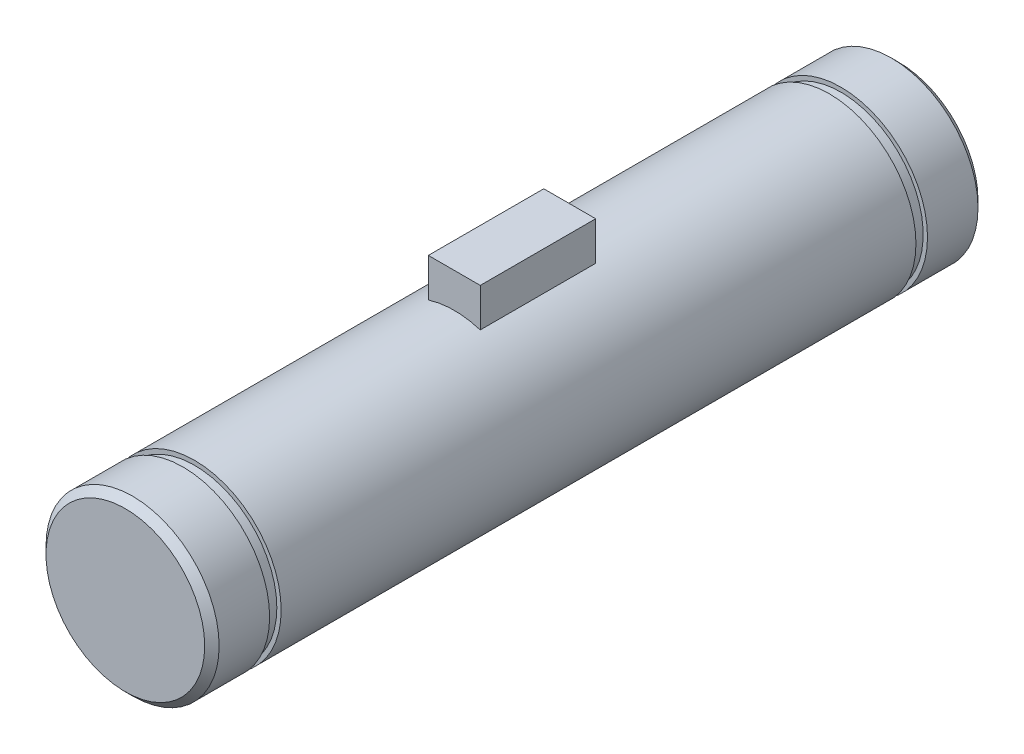
ISO-10303-21;
HEADER;
FILE_DESCRIPTION(('STEP AP214'),'2;1');
FILE_NAME('part.step','',(''),(''),'','','');
FILE_SCHEMA(('AUTOMOTIVE_DESIGN { 1 0 10303 214 1 1 1 1 }'));
ENDSEC;
DATA;
#1=APPLICATION_CONTEXT('core data for automotive mechanical design processes');
#2=APPLICATION_PROTOCOL_DEFINITION('international standard','automotive_design',2000,#1);
#3=PRODUCT_CONTEXT('',#1,'mechanical');
#4=PRODUCT('Part','Part','',(#3));
#5=PRODUCT_RELATED_PRODUCT_CATEGORY('part','',(#4));
#6=PRODUCT_DEFINITION_FORMATION('','',#4);
#7=PRODUCT_DEFINITION_CONTEXT('part definition',#1,'design');
#8=PRODUCT_DEFINITION('design','',#6,#7);
#9=PRODUCT_DEFINITION_SHAPE('','',#8);
#10=(LENGTH_UNIT() NAMED_UNIT(*) SI_UNIT(.MILLI.,.METRE.));
#11=(NAMED_UNIT(*) PLANE_ANGLE_UNIT() SI_UNIT($,.RADIAN.));
#12=(NAMED_UNIT(*) SI_UNIT($,.STERADIAN.) SOLID_ANGLE_UNIT());
#13=UNCERTAINTY_MEASURE_WITH_UNIT(LENGTH_MEASURE(1.E-05),#10,'distance_accuracy_value','');
#14=(GEOMETRIC_REPRESENTATION_CONTEXT(3) GLOBAL_UNCERTAINTY_ASSIGNED_CONTEXT((#13)) GLOBAL_UNIT_ASSIGNED_CONTEXT((#10,
#11,#12)) REPRESENTATION_CONTEXT('',''));
#15=CARTESIAN_POINT('',(0.,0.,0.));
#16=DIRECTION('',(0.,0.,1.));
#17=DIRECTION('',(1.,0.,0.));
#18=AXIS2_PLACEMENT_3D('',#15,#16,#17);
#19=CARTESIAN_POINT('',(0.,0.,26.8));
#20=DIRECTION('',(0.,0.,-1.));
#21=DIRECTION('',(-1.,0.,0.));
#22=AXIS2_PLACEMENT_3D('',#19,#20,#21);
#23=CYLINDRICAL_SURFACE('',#22,3.);
#24=CARTESIAN_POINT('',(0.,0.,15.4));
#25=DIRECTION('',(0.,0.,-1.));
#26=DIRECTION('',(-1.,0.,0.));
#27=AXIS2_PLACEMENT_3D('',#24,#25,#26);
#28=CIRCLE('',#27,3.);
#29=CARTESIAN_POINT('',(-0.9,2.86181760425084,15.4));
#30=VERTEX_POINT('',#29);
#31=CARTESIAN_POINT('',(0.9,2.86181760425084,15.4));
#32=VERTEX_POINT('',#31);
#33=EDGE_CURVE('E116',#30,#32,#28,.T.);
#34=ORIENTED_EDGE('',*,*,#33,.F.);
#35=DIRECTION('',(0.,0.,-1.));
#36=VECTOR('',#35,1.);
#37=CARTESIAN_POINT('',(-0.9,2.86181760425084,26.8));
#38=LINE('',#37,#36);
#39=CARTESIAN_POINT('',(-0.9,2.86181760425084,11.4));
#40=VERTEX_POINT('',#39);
#41=EDGE_CURVE('E61',#30,#40,#38,.T.);
#42=ORIENTED_EDGE('',*,*,#41,.T.);
#43=CARTESIAN_POINT('',(0.,0.,11.4));
#44=DIRECTION('',(0.,0.,-1.));
#45=DIRECTION('',(-1.,0.,0.));
#46=AXIS2_PLACEMENT_3D('',#43,#44,#45);
#47=CIRCLE('',#46,3.);
#48=CARTESIAN_POINT('',(0.9,2.86181760425084,11.4));
#49=VERTEX_POINT('',#48);
#50=EDGE_CURVE('E108',#40,#49,#47,.T.);
#51=ORIENTED_EDGE('',*,*,#50,.T.);
#52=DIRECTION('',(0.,0.,-1.));
#53=VECTOR('',#52,1.);
#54=CARTESIAN_POINT('',(0.9,2.86181760425084,26.8));
#55=LINE('',#54,#53);
#56=EDGE_CURVE('E113',#49,#32,#55,.F.);
#57=ORIENTED_EDGE('',*,*,#56,.T.);
#58=EDGE_LOOP('',(#34,#42,#51,#57));
#59=FACE_BOUND('',#58,.T.);
#60=CARTESIAN_POINT('',(0.,0.,2.4));
#61=DIRECTION('',(0.,0.,-1.));
#62=DIRECTION('',(-1.,0.,0.));
#63=AXIS2_PLACEMENT_3D('',#60,#61,#62);
#64=CIRCLE('',#63,3.);
#65=CARTESIAN_POINT('',(-3.,0.,2.4));
#66=VERTEX_POINT('',#65);
#67=EDGE_CURVE('E105',#66,#66,#64,.T.);
#68=ORIENTED_EDGE('',*,*,#67,.F.);
#69=EDGE_LOOP('',(#68));
#70=FACE_BOUND('',#69,.T.);
#71=CARTESIAN_POINT('',(0.,0.,24.4));
#72=DIRECTION('',(0.,0.,1.));
#73=DIRECTION('',(1.,0.,0.));
#74=AXIS2_PLACEMENT_3D('',#71,#72,#73);
#75=CIRCLE('',#74,3.);
#76=CARTESIAN_POINT('',(3.,0.,24.4));
#77=VERTEX_POINT('',#76);
#78=EDGE_CURVE('E122',#77,#77,#75,.T.);
#79=ORIENTED_EDGE('',*,*,#78,.F.);
#80=EDGE_LOOP('',(#79));
#81=FACE_BOUND('',#80,.T.);
#82=ADVANCED_FACE('F38',(#59,#70,#81),#23,.T.);
#83=CARTESIAN_POINT('',(0.9,4.2,15.4));
#84=DIRECTION('',(1.,0.,0.));
#85=DIRECTION('',(0.,1.,0.));
#86=AXIS2_PLACEMENT_3D('',#83,#84,#85);
#87=PLANE('',#86);
#88=ORIENTED_EDGE('',*,*,#56,.F.);
#89=DIRECTION('',(0.,-1.,0.));
#90=VECTOR('',#89,1.);
#91=CARTESIAN_POINT('',(0.9,4.2,11.4));
#92=LINE('',#91,#90);
#93=CARTESIAN_POINT('',(0.9,4.2,11.4));
#94=VERTEX_POINT('',#93);
#95=EDGE_CURVE('E53',#94,#49,#92,.T.);
#96=ORIENTED_EDGE('',*,*,#95,.F.);
#97=DIRECTION('',(0.,0.,-1.));
#98=VECTOR('',#97,1.);
#99=CARTESIAN_POINT('',(0.9,4.2,15.4));
#100=LINE('',#99,#98);
#101=CARTESIAN_POINT('',(0.9,4.2,15.4));
#102=VERTEX_POINT('',#101);
#103=EDGE_CURVE('E94',#102,#94,#100,.T.);
#104=ORIENTED_EDGE('',*,*,#103,.F.);
#105=DIRECTION('',(0.,-1.,0.));
#106=VECTOR('',#105,1.);
#107=CARTESIAN_POINT('',(0.9,4.2,15.4));
#108=LINE('',#107,#106);
#109=EDGE_CURVE('E95',#102,#32,#108,.T.);
#110=ORIENTED_EDGE('',*,*,#109,.T.);
#111=EDGE_LOOP('',(#88,#96,#104,#110));
#112=FACE_BOUND('',#111,.T.);
#113=ADVANCED_FACE('F146',(#112),#87,.T.);
#114=CARTESIAN_POINT('',(-0.9,0.,15.4));
#115=DIRECTION('',(-1.,0.,0.));
#116=DIRECTION('',(0.,0.,1.));
#117=AXIS2_PLACEMENT_3D('',#114,#115,#116);
#118=PLANE('',#117);
#119=ORIENTED_EDGE('',*,*,#41,.F.);
#120=DIRECTION('',(0.,1.,0.));
#121=VECTOR('',#120,1.);
#122=CARTESIAN_POINT('',(-0.9,0.,15.4));
#123=LINE('',#122,#121);
#124=CARTESIAN_POINT('',(-0.9,4.2,15.4));
#125=VERTEX_POINT('',#124);
#126=EDGE_CURVE('E79',#30,#125,#123,.T.);
#127=ORIENTED_EDGE('',*,*,#126,.T.);
#128=DIRECTION('',(0.,0.,-1.));
#129=VECTOR('',#128,1.);
#130=CARTESIAN_POINT('',(-0.9,4.2,15.4));
#131=LINE('',#130,#129);
#132=CARTESIAN_POINT('',(-0.9,4.2,11.4));
#133=VERTEX_POINT('',#132);
#134=EDGE_CURVE('E82',#125,#133,#131,.T.);
#135=ORIENTED_EDGE('',*,*,#134,.T.);
#136=DIRECTION('',(0.,1.,0.));
#137=VECTOR('',#136,1.);
#138=CARTESIAN_POINT('',(-0.9,0.,11.4));
#139=LINE('',#138,#137);
#140=EDGE_CURVE('E103',#40,#133,#139,.T.);
#141=ORIENTED_EDGE('',*,*,#140,.F.);
#142=EDGE_LOOP('',(#119,#127,#135,#141));
#143=FACE_BOUND('',#142,.T.);
#144=ADVANCED_FACE('F81',(#143),#118,.T.);
#145=CARTESIAN_POINT('',(0.,0.,15.4));
#146=DIRECTION('',(0.,0.,-1.));
#147=DIRECTION('',(-1.,0.,0.));
#148=AXIS2_PLACEMENT_3D('',#145,#146,#147);
#149=PLANE('',#148);
#150=ORIENTED_EDGE('',*,*,#126,.F.);
#151=ORIENTED_EDGE('',*,*,#33,.T.);
#152=ORIENTED_EDGE('',*,*,#109,.F.);
#153=DIRECTION('',(1.,0.,0.));
#154=VECTOR('',#153,1.);
#155=CARTESIAN_POINT('',(-0.9,4.2,15.4));
#156=LINE('',#155,#154);
#157=EDGE_CURVE('E87',#125,#102,#156,.T.);
#158=ORIENTED_EDGE('',*,*,#157,.F.);
#159=EDGE_LOOP('',(#150,#151,#152,#158));
#160=FACE_BOUND('',#159,.T.);
#161=ADVANCED_FACE('F97',(#160),#149,.F.);
#162=CARTESIAN_POINT('',(0.,0.,11.4));
#163=DIRECTION('',(0.,0.,-1.));
#164=DIRECTION('',(-1.,0.,0.));
#165=AXIS2_PLACEMENT_3D('',#162,#163,#164);
#166=PLANE('',#165);
#167=ORIENTED_EDGE('',*,*,#50,.F.);
#168=ORIENTED_EDGE('',*,*,#140,.T.);
#169=DIRECTION('',(1.,0.,0.));
#170=VECTOR('',#169,1.);
#171=CARTESIAN_POINT('',(-0.9,4.2,11.4));
#172=LINE('',#171,#170);
#173=EDGE_CURVE('E93',#133,#94,#172,.T.);
#174=ORIENTED_EDGE('',*,*,#173,.T.);
#175=ORIENTED_EDGE('',*,*,#95,.T.);
#176=EDGE_LOOP('',(#167,#168,#174,#175));
#177=FACE_BOUND('',#176,.T.);
#178=ADVANCED_FACE('F222',(#177),#166,.T.);
#179=CARTESIAN_POINT('',(-0.9,4.2,15.4));
#180=DIRECTION('',(0.,1.,0.));
#181=DIRECTION('',(0.,0.,1.));
#182=AXIS2_PLACEMENT_3D('',#179,#180,#181);
#183=PLANE('',#182);
#184=ORIENTED_EDGE('',*,*,#173,.F.);
#185=ORIENTED_EDGE('',*,*,#134,.F.);
#186=ORIENTED_EDGE('',*,*,#157,.T.);
#187=ORIENTED_EDGE('',*,*,#103,.T.);
#188=EDGE_LOOP('',(#184,#185,#186,#187));
#189=FACE_BOUND('',#188,.T.);
#190=ADVANCED_FACE('F91',(#189),#183,.T.);
#191=CARTESIAN_POINT('',(0.,0.,2.4));
#192=DIRECTION('',(0.,0.,-1.));
#193=DIRECTION('',(-1.,0.,0.));
#194=AXIS2_PLACEMENT_3D('',#191,#192,#193);
#195=PLANE('',#194);
#196=CARTESIAN_POINT('',(0.,0.,2.4));
#197=DIRECTION('',(0.,0.,-1.));
#198=DIRECTION('',(-1.,0.,0.));
#199=AXIS2_PLACEMENT_3D('',#196,#197,#198);
#200=CIRCLE('',#199,2.85);
#201=CARTESIAN_POINT('',(-2.85,0.,2.4));
#202=VERTEX_POINT('',#201);
#203=EDGE_CURVE('E178',#202,#202,#200,.T.);
#204=ORIENTED_EDGE('',*,*,#203,.F.);
#205=EDGE_LOOP('',(#204));
#206=FACE_BOUND('',#205,.T.);
#207=ORIENTED_EDGE('',*,*,#67,.T.);
#208=EDGE_LOOP('',(#207));
#209=FACE_BOUND('',#208,.T.);
#210=ADVANCED_FACE('F213',(#206,#209),#195,.T.);
#211=CARTESIAN_POINT('',(0.,0.,2.));
#212=DIRECTION('',(0.,0.,-1.));
#213=DIRECTION('',(-1.,0.,0.));
#214=AXIS2_PLACEMENT_3D('',#211,#212,#213);
#215=PLANE('',#214);
#216=CARTESIAN_POINT('',(0.,0.,2.));
#217=DIRECTION('',(0.,0.,-1.));
#218=DIRECTION('',(-1.,0.,0.));
#219=AXIS2_PLACEMENT_3D('',#216,#217,#218);
#220=CIRCLE('',#219,2.85);
#221=CARTESIAN_POINT('',(-2.85,0.,2.));
#222=VERTEX_POINT('',#221);
#223=EDGE_CURVE('E126',#222,#222,#220,.T.);
#224=ORIENTED_EDGE('',*,*,#223,.T.);
#225=EDGE_LOOP('',(#224));
#226=FACE_BOUND('',#225,.T.);
#227=CARTESIAN_POINT('',(0.,0.,2.));
#228=DIRECTION('',(0.,0.,-1.));
#229=DIRECTION('',(-1.,0.,0.));
#230=AXIS2_PLACEMENT_3D('',#227,#228,#229);
#231=CIRCLE('',#230,3.);
#232=CARTESIAN_POINT('',(-3.,0.,2.));
#233=VERTEX_POINT('',#232);
#234=EDGE_CURVE('E176',#233,#233,#231,.T.);
#235=ORIENTED_EDGE('',*,*,#234,.F.);
#236=EDGE_LOOP('',(#235));
#237=FACE_BOUND('',#236,.T.);
#238=ADVANCED_FACE('F211',(#226,#237),#215,.F.);
#239=CARTESIAN_POINT('',(0.,0.,2.4));
#240=DIRECTION('',(0.,0.,-1.));
#241=DIRECTION('',(-1.,0.,0.));
#242=AXIS2_PLACEMENT_3D('',#239,#240,#241);
#243=CYLINDRICAL_SURFACE('',#242,2.85);
#244=ORIENTED_EDGE('',*,*,#203,.T.);
#245=EDGE_LOOP('',(#244));
#246=FACE_BOUND('',#245,.T.);
#247=ORIENTED_EDGE('',*,*,#223,.F.);
#248=EDGE_LOOP('',(#247));
#249=FACE_BOUND('',#248,.T.);
#250=ADVANCED_FACE('F170',(#246,#249),#243,.T.);
#251=CARTESIAN_POINT('',(0.,0.,0.));
#252=DIRECTION('',(0.,0.,1.));
#253=DIRECTION('',(1.,0.,0.));
#254=AXIS2_PLACEMENT_3D('',#251,#252,#253);
#255=PLANE('',#254);
#256=CARTESIAN_POINT('',(0.,0.,0.));
#257=DIRECTION('',(0.,0.,1.));
#258=DIRECTION('',(1.,0.,0.));
#259=AXIS2_PLACEMENT_3D('',#256,#257,#258);
#260=CIRCLE('',#259,2.75);
#261=CARTESIAN_POINT('',(2.75,0.,0.));
#262=VERTEX_POINT('',#261);
#263=EDGE_CURVE('E129',#262,#262,#260,.F.);
#264=ORIENTED_EDGE('',*,*,#263,.T.);
#265=EDGE_LOOP('',(#264));
#266=FACE_BOUND('',#265,.T.);
#267=ADVANCED_FACE('F161',(#266),#255,.F.);
#268=CARTESIAN_POINT('',(0.,0.,0.249999999999997));
#269=DIRECTION('',(0.,0.,1.));
#270=DIRECTION('',(1.,0.,0.));
#271=AXIS2_PLACEMENT_3D('',#268,#269,#270);
#272=CIRCLE('',#271,3.);
#273=CARTESIAN_POINT('',(3.,0.,0.249999999999997));
#274=VERTEX_POINT('',#273);
#275=EDGE_CURVE('E118',#274,#274,#272,.T.);
#276=ORIENTED_EDGE('',*,*,#275,.T.);
#277=EDGE_LOOP('',(#276));
#278=FACE_BOUND('',#277,.T.);
#279=ORIENTED_EDGE('',*,*,#234,.T.);
#280=EDGE_LOOP('',(#279));
#281=FACE_BOUND('',#280,.T.);
#282=ADVANCED_FACE('F149',(#278,#281),#23,.T.);
#283=CARTESIAN_POINT('',(0.,0.,24.4));
#284=DIRECTION('',(0.,0.,1.));
#285=DIRECTION('',(1.,0.,0.));
#286=AXIS2_PLACEMENT_3D('',#283,#284,#285);
#287=PLANE('',#286);
#288=CARTESIAN_POINT('',(0.,0.,24.4));
#289=DIRECTION('',(0.,0.,1.));
#290=DIRECTION('',(1.,0.,0.));
#291=AXIS2_PLACEMENT_3D('',#288,#289,#290);
#292=CIRCLE('',#291,2.85);
#293=CARTESIAN_POINT('',(2.85,0.,24.4));
#294=VERTEX_POINT('',#293);
#295=EDGE_CURVE('E123',#294,#294,#292,.T.);
#296=ORIENTED_EDGE('',*,*,#295,.F.);
#297=EDGE_LOOP('',(#296));
#298=FACE_BOUND('',#297,.T.);
#299=ORIENTED_EDGE('',*,*,#78,.T.);
#300=EDGE_LOOP('',(#299));
#301=FACE_BOUND('',#300,.T.);
#302=ADVANCED_FACE('F160',(#298,#301),#287,.T.);
#303=CARTESIAN_POINT('',(0.,0.,24.8));
#304=DIRECTION('',(0.,0.,1.));
#305=DIRECTION('',(1.,0.,0.));
#306=AXIS2_PLACEMENT_3D('',#303,#304,#305);
#307=PLANE('',#306);
#308=CARTESIAN_POINT('',(0.,0.,24.8));
#309=DIRECTION('',(0.,0.,1.));
#310=DIRECTION('',(1.,0.,0.));
#311=AXIS2_PLACEMENT_3D('',#308,#309,#310);
#312=CIRCLE('',#311,2.85);
#313=CARTESIAN_POINT('',(2.85,0.,24.8));
#314=VERTEX_POINT('',#313);
#315=EDGE_CURVE('E186',#314,#314,#312,.T.);
#316=ORIENTED_EDGE('',*,*,#315,.T.);
#317=EDGE_LOOP('',(#316));
#318=FACE_BOUND('',#317,.T.);
#319=CARTESIAN_POINT('',(0.,0.,24.8));
#320=DIRECTION('',(0.,0.,1.));
#321=DIRECTION('',(1.,0.,0.));
#322=AXIS2_PLACEMENT_3D('',#319,#320,#321);
#323=CIRCLE('',#322,3.);
#324=CARTESIAN_POINT('',(3.,0.,24.8));
#325=VERTEX_POINT('',#324);
#326=EDGE_CURVE('E119',#325,#325,#323,.T.);
#327=ORIENTED_EDGE('',*,*,#326,.F.);
#328=EDGE_LOOP('',(#327));
#329=FACE_BOUND('',#328,.T.);
#330=ADVANCED_FACE('F167',(#318,#329),#307,.F.);
#331=CARTESIAN_POINT('',(0.,0.,24.4));
#332=DIRECTION('',(0.,0.,1.));
#333=DIRECTION('',(1.,0.,0.));
#334=AXIS2_PLACEMENT_3D('',#331,#332,#333);
#335=CYLINDRICAL_SURFACE('',#334,2.85);
#336=ORIENTED_EDGE('',*,*,#295,.T.);
#337=EDGE_LOOP('',(#336));
#338=FACE_BOUND('',#337,.T.);
#339=ORIENTED_EDGE('',*,*,#315,.F.);
#340=EDGE_LOOP('',(#339));
#341=FACE_BOUND('',#340,.T.);
#342=ADVANCED_FACE('F192',(#338,#341),#335,.T.);
#343=CARTESIAN_POINT('',(0.,0.,26.8));
#344=DIRECTION('',(0.,0.,1.));
#345=DIRECTION('',(1.,0.,0.));
#346=AXIS2_PLACEMENT_3D('',#343,#344,#345);
#347=PLANE('',#346);
#348=CARTESIAN_POINT('',(0.,0.,26.8));
#349=DIRECTION('',(0.,0.,1.));
#350=DIRECTION('',(1.,0.,0.));
#351=AXIS2_PLACEMENT_3D('',#348,#349,#350);
#352=CIRCLE('',#351,2.75);
#353=CARTESIAN_POINT('',(2.75,0.,26.8));
#354=VERTEX_POINT('',#353);
#355=EDGE_CURVE('E46',#354,#354,#352,.T.);
#356=ORIENTED_EDGE('',*,*,#355,.T.);
#357=EDGE_LOOP('',(#356));
#358=FACE_BOUND('',#357,.T.);
#359=ADVANCED_FACE('F134',(#358),#347,.T.);
#360=CARTESIAN_POINT('',(0.,0.,26.55));
#361=DIRECTION('',(0.,0.,1.));
#362=DIRECTION('',(1.,0.,0.));
#363=AXIS2_PLACEMENT_3D('',#360,#361,#362);
#364=CIRCLE('',#363,3.);
#365=CARTESIAN_POINT('',(3.,0.,26.55));
#366=VERTEX_POINT('',#365);
#367=EDGE_CURVE('E11',#366,#366,#364,.F.);
#368=ORIENTED_EDGE('',*,*,#367,.T.);
#369=EDGE_LOOP('',(#368));
#370=FACE_BOUND('',#369,.T.);
#371=ORIENTED_EDGE('',*,*,#326,.T.);
#372=EDGE_LOOP('',(#371));
#373=FACE_BOUND('',#372,.T.);
#374=ADVANCED_FACE('F142',(#370,#373),#23,.T.);
#375=CARTESIAN_POINT('',(0.,0.,0.249999999999997));
#376=DIRECTION('',(0.,0.,1.));
#377=DIRECTION('',(1.,0.,0.));
#378=AXIS2_PLACEMENT_3D('',#375,#376,#377);
#379=CONICAL_SURFACE('',#378,3.,0.785398163397455);
#380=ORIENTED_EDGE('',*,*,#263,.F.);
#381=EDGE_LOOP('',(#380));
#382=FACE_BOUND('',#381,.T.);
#383=ORIENTED_EDGE('',*,*,#275,.F.);
#384=EDGE_LOOP('',(#383));
#385=FACE_BOUND('',#384,.T.);
#386=ADVANCED_FACE('F137',(#382,#385),#379,.T.);
#387=CARTESIAN_POINT('',(0.,0.,26.8));
#388=DIRECTION('',(0.,0.,-1.));
#389=DIRECTION('',(-1.,0.,0.));
#390=AXIS2_PLACEMENT_3D('',#387,#388,#389);
#391=CONICAL_SURFACE('',#390,2.75,0.785398163397448);
#392=ORIENTED_EDGE('',*,*,#367,.F.);
#393=EDGE_LOOP('',(#392));
#394=FACE_BOUND('',#393,.T.);
#395=ORIENTED_EDGE('',*,*,#355,.F.);
#396=EDGE_LOOP('',(#395));
#397=FACE_BOUND('',#396,.T.);
#398=ADVANCED_FACE('F40',(#394,#397),#391,.T.);
#399=CLOSED_SHELL('',(#82,#113,#144,#161,#178,#190,#210,#238,#250,#267,#282,#302,#330,#342,#359,
#374,#386,#398));
#400=MANIFOLD_SOLID_BREP('B2',#399);
#401=ADVANCED_BREP_SHAPE_REPRESENTATION('',(#18,#400),#14);
#402=SHAPE_DEFINITION_REPRESENTATION(#9,#401);
ENDSEC;
END-ISO-10303-21;
